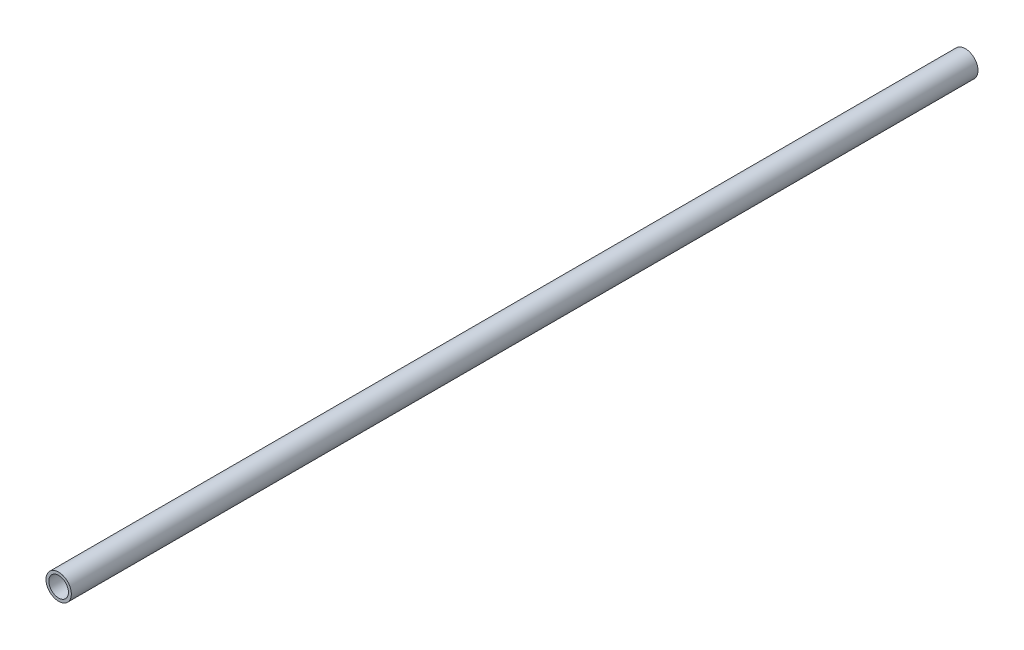
ISO-10303-21;
HEADER;
FILE_DESCRIPTION(('STEP AP214'),'2;1');
FILE_NAME('part.step','',(''),(''),'','','');
FILE_SCHEMA(('AUTOMOTIVE_DESIGN { 1 0 10303 214 1 1 1 1 }'));
ENDSEC;
DATA;
#1=APPLICATION_CONTEXT('core data for automotive mechanical design processes');
#2=APPLICATION_PROTOCOL_DEFINITION('international standard','automotive_design',2000,#1);
#3=PRODUCT_CONTEXT('',#1,'mechanical');
#4=PRODUCT('Part','Part','',(#3));
#5=PRODUCT_RELATED_PRODUCT_CATEGORY('part','',(#4));
#6=PRODUCT_DEFINITION_FORMATION('','',#4);
#7=PRODUCT_DEFINITION_CONTEXT('part definition',#1,'design');
#8=PRODUCT_DEFINITION('design','',#6,#7);
#9=PRODUCT_DEFINITION_SHAPE('','',#8);
#10=(LENGTH_UNIT() NAMED_UNIT(*) SI_UNIT(.MILLI.,.METRE.));
#11=(NAMED_UNIT(*) PLANE_ANGLE_UNIT() SI_UNIT($,.RADIAN.));
#12=(NAMED_UNIT(*) SI_UNIT($,.STERADIAN.) SOLID_ANGLE_UNIT());
#13=UNCERTAINTY_MEASURE_WITH_UNIT(LENGTH_MEASURE(1.E-05),#10,'distance_accuracy_value','');
#14=(GEOMETRIC_REPRESENTATION_CONTEXT(3) GLOBAL_UNCERTAINTY_ASSIGNED_CONTEXT((#13)) GLOBAL_UNIT_ASSIGNED_CONTEXT((#10,
#11,#12)) REPRESENTATION_CONTEXT('',''));
#15=CARTESIAN_POINT('',(0.,0.,0.));
#16=DIRECTION('',(0.,0.,1.));
#17=DIRECTION('',(1.,0.,0.));
#18=AXIS2_PLACEMENT_3D('',#15,#16,#17);
#19=CARTESIAN_POINT('',(0.,0.,170.3094511));
#20=DIRECTION('',(0.,0.,1.));
#21=DIRECTION('',(1.,0.,0.));
#22=AXIS2_PLACEMENT_3D('',#19,#20,#21);
#23=PLANE('',#22);
#24=CARTESIAN_POINT('',(0.,0.,170.3094511));
#25=DIRECTION('',(0.,0.,1.));
#26=DIRECTION('',(1.,0.,0.));
#27=AXIS2_PLACEMENT_3D('',#24,#25,#26);
#28=CIRCLE('',#27,4.7625);
#29=CARTESIAN_POINT('',(4.7625,0.,170.3094511));
#30=VERTEX_POINT('',#29);
#31=EDGE_CURVE('E10',#30,#30,#28,.T.);
#32=ORIENTED_EDGE('',*,*,#31,.T.);
#33=EDGE_LOOP('',(#32));
#34=FACE_BOUND('',#33,.T.);
#35=CARTESIAN_POINT('',(0.,0.,170.3094511));
#36=DIRECTION('',(0.,0.,1.));
#37=DIRECTION('',(1.,0.,0.));
#38=AXIS2_PLACEMENT_3D('',#35,#36,#37);
#39=CIRCLE('',#38,3.683);
#40=CARTESIAN_POINT('',(3.683,0.,170.3094511));
#41=VERTEX_POINT('',#40);
#42=EDGE_CURVE('E43',#41,#41,#39,.T.);
#43=ORIENTED_EDGE('',*,*,#42,.F.);
#44=EDGE_LOOP('',(#43));
#45=FACE_BOUND('',#44,.T.);
#46=ADVANCED_FACE('F32',(#34,#45),#23,.T.);
#47=CARTESIAN_POINT('',(0.,0.,-170.3094511));
#48=DIRECTION('',(0.,0.,1.));
#49=DIRECTION('',(1.,0.,0.));
#50=AXIS2_PLACEMENT_3D('',#47,#48,#49);
#51=PLANE('',#50);
#52=CARTESIAN_POINT('',(0.,0.,-170.3094511));
#53=DIRECTION('',(0.,0.,1.));
#54=DIRECTION('',(1.,0.,0.));
#55=AXIS2_PLACEMENT_3D('',#52,#53,#54);
#56=CIRCLE('',#55,4.7625);
#57=CARTESIAN_POINT('',(4.7625,0.,-170.3094511));
#58=VERTEX_POINT('',#57);
#59=EDGE_CURVE('E36',#58,#58,#56,.T.);
#60=ORIENTED_EDGE('',*,*,#59,.F.);
#61=EDGE_LOOP('',(#60));
#62=FACE_BOUND('',#61,.T.);
#63=CARTESIAN_POINT('',(0.,0.,-170.3094511));
#64=DIRECTION('',(0.,0.,1.));
#65=DIRECTION('',(1.,0.,0.));
#66=AXIS2_PLACEMENT_3D('',#63,#64,#65);
#67=CIRCLE('',#66,3.683);
#68=CARTESIAN_POINT('',(3.683,0.,-170.3094511));
#69=VERTEX_POINT('',#68);
#70=EDGE_CURVE('E45',#69,#69,#67,.T.);
#71=ORIENTED_EDGE('',*,*,#70,.T.);
#72=EDGE_LOOP('',(#71));
#73=FACE_BOUND('',#72,.T.);
#74=ADVANCED_FACE('F55',(#62,#73),#51,.F.);
#75=CARTESIAN_POINT('',(0.,0.,170.3094511));
#76=DIRECTION('',(0.,0.,-1.));
#77=DIRECTION('',(-1.,0.,0.));
#78=AXIS2_PLACEMENT_3D('',#75,#76,#77);
#79=CYLINDRICAL_SURFACE('',#78,4.7625);
#80=ORIENTED_EDGE('',*,*,#31,.F.);
#81=EDGE_LOOP('',(#80));
#82=FACE_BOUND('',#81,.T.);
#83=ORIENTED_EDGE('',*,*,#59,.T.);
#84=EDGE_LOOP('',(#83));
#85=FACE_BOUND('',#84,.T.);
#86=ADVANCED_FACE('F34',(#82,#85),#79,.T.);
#87=CARTESIAN_POINT('',(0.,0.,170.3094511));
#88=DIRECTION('',(0.,0.,-1.));
#89=DIRECTION('',(-1.,0.,0.));
#90=AXIS2_PLACEMENT_3D('',#87,#88,#89);
#91=CYLINDRICAL_SURFACE('',#90,3.683);
#92=ORIENTED_EDGE('',*,*,#42,.T.);
#93=EDGE_LOOP('',(#92));
#94=FACE_BOUND('',#93,.T.);
#95=ORIENTED_EDGE('',*,*,#70,.F.);
#96=EDGE_LOOP('',(#95));
#97=FACE_BOUND('',#96,.T.);
#98=ADVANCED_FACE('F51',(#94,#97),#91,.F.);
#99=CLOSED_SHELL('',(#46,#74,#86,#98));
#100=MANIFOLD_SOLID_BREP('B2',#99);
#101=ADVANCED_BREP_SHAPE_REPRESENTATION('',(#18,#100),#14);
#102=SHAPE_DEFINITION_REPRESENTATION(#9,#101);
ENDSEC;
END-ISO-10303-21;
